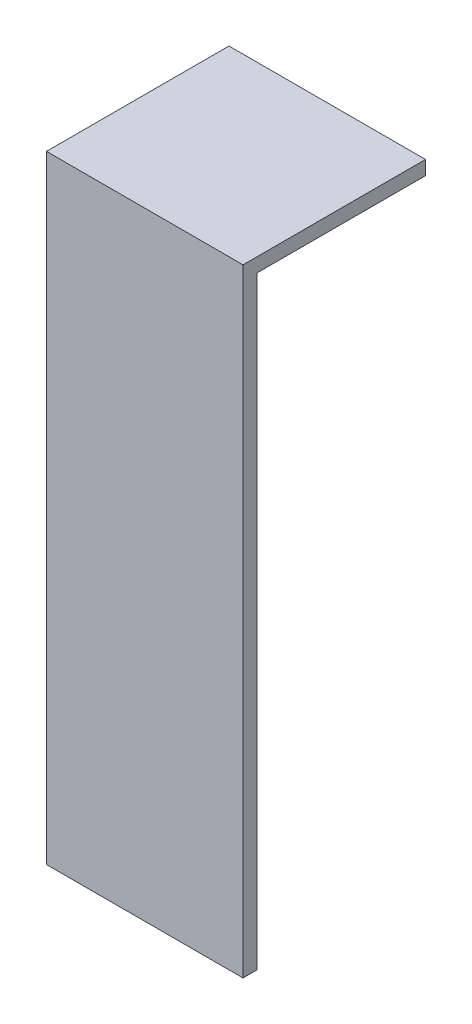
ISO-10303-21;
HEADER;
FILE_DESCRIPTION(('STEP AP214'),'2;1');
FILE_NAME('part.step','',(''),(''),'','','');
FILE_SCHEMA(('AUTOMOTIVE_DESIGN { 1 0 10303 214 1 1 1 1 }'));
ENDSEC;
DATA;
#1=APPLICATION_CONTEXT('core data for automotive mechanical design processes');
#2=APPLICATION_PROTOCOL_DEFINITION('international standard','automotive_design',2000,#1);
#3=PRODUCT_CONTEXT('',#1,'mechanical');
#4=PRODUCT('Part','Part','',(#3));
#5=PRODUCT_RELATED_PRODUCT_CATEGORY('part','',(#4));
#6=PRODUCT_DEFINITION_FORMATION('','',#4);
#7=PRODUCT_DEFINITION_CONTEXT('part definition',#1,'design');
#8=PRODUCT_DEFINITION('design','',#6,#7);
#9=PRODUCT_DEFINITION_SHAPE('','',#8);
#10=(LENGTH_UNIT() NAMED_UNIT(*) SI_UNIT(.MILLI.,.METRE.));
#11=(NAMED_UNIT(*) PLANE_ANGLE_UNIT() SI_UNIT($,.RADIAN.));
#12=(NAMED_UNIT(*) SI_UNIT($,.STERADIAN.) SOLID_ANGLE_UNIT());
#13=UNCERTAINTY_MEASURE_WITH_UNIT(LENGTH_MEASURE(1.E-05),#10,'distance_accuracy_value','');
#14=(GEOMETRIC_REPRESENTATION_CONTEXT(3) GLOBAL_UNCERTAINTY_ASSIGNED_CONTEXT((#13)) GLOBAL_UNIT_ASSIGNED_CONTEXT((#10,
#11,#12)) REPRESENTATION_CONTEXT('',''));
#15=CARTESIAN_POINT('',(0.,0.,0.));
#16=DIRECTION('',(0.,0.,1.));
#17=DIRECTION('',(1.,0.,0.));
#18=AXIS2_PLACEMENT_3D('',#15,#16,#17);
#19=CARTESIAN_POINT('',(-32.4311061643855,110.,5.));
#20=DIRECTION('',(-1.,0.,0.));
#21=DIRECTION('',(0.,-1.,0.));
#22=AXIS2_PLACEMENT_3D('',#19,#20,#21);
#23=PLANE('',#22);
#24=DIRECTION('',(0.,1.,0.));
#25=VECTOR('',#24,1.);
#26=CARTESIAN_POINT('',(-32.4311061643855,110.,0.));
#27=LINE('',#26,#25);
#28=CARTESIAN_POINT('',(-32.4311061643855,-110.,0.));
#29=VERTEX_POINT('',#28);
#30=CARTESIAN_POINT('',(-32.4311061643855,105.,0.));
#31=VERTEX_POINT('',#30);
#32=EDGE_CURVE('E127',#29,#31,#27,.T.);
#33=ORIENTED_EDGE('',*,*,#32,.T.);
#34=DIRECTION('',(0.,0.,1.));
#35=VECTOR('',#34,1.);
#36=CARTESIAN_POINT('',(-32.4311061643855,105.,-60.));
#37=LINE('',#36,#35);
#38=CARTESIAN_POINT('',(-32.4311061643855,105.,-60.));
#39=VERTEX_POINT('',#38);
#40=EDGE_CURVE('E172',#39,#31,#37,.T.);
#41=ORIENTED_EDGE('',*,*,#40,.F.);
#42=DIRECTION('',(0.,1.,0.));
#43=VECTOR('',#42,1.);
#44=CARTESIAN_POINT('',(-32.4311061643855,110.,-60.));
#45=LINE('',#44,#43);
#46=CARTESIAN_POINT('',(-32.4311061643855,110.,-60.));
#47=VERTEX_POINT('',#46);
#48=EDGE_CURVE('E219',#39,#47,#45,.T.);
#49=ORIENTED_EDGE('',*,*,#48,.T.);
#50=DIRECTION('',(0.,0.,-1.));
#51=VECTOR('',#50,1.);
#52=CARTESIAN_POINT('',(-32.4311061643855,110.,5.));
#53=LINE('',#52,#51);
#54=CARTESIAN_POINT('',(-32.4311061643855,110.,5.));
#55=VERTEX_POINT('',#54);
#56=EDGE_CURVE('E11',#55,#47,#53,.T.);
#57=ORIENTED_EDGE('',*,*,#56,.F.);
#58=DIRECTION('',(0.,1.,0.));
#59=VECTOR('',#58,1.);
#60=CARTESIAN_POINT('',(-32.4311061643855,110.,5.));
#61=LINE('',#60,#59);
#62=CARTESIAN_POINT('',(-32.4311061643855,-110.,5.));
#63=VERTEX_POINT('',#62);
#64=EDGE_CURVE('E103',#63,#55,#61,.T.);
#65=ORIENTED_EDGE('',*,*,#64,.F.);
#66=DIRECTION('',(0.,0.,-1.));
#67=VECTOR('',#66,1.);
#68=CARTESIAN_POINT('',(-32.4311061643855,-110.,5.));
#69=LINE('',#68,#67);
#70=EDGE_CURVE('E123',#63,#29,#69,.T.);
#71=ORIENTED_EDGE('',*,*,#70,.T.);
#72=EDGE_LOOP('',(#33,#41,#49,#57,#65,#71));
#73=FACE_BOUND('',#72,.T.);
#74=ADVANCED_FACE('F39',(#73),#23,.F.);
#75=CARTESIAN_POINT('',(-102.431106164386,110.,5.));
#76=DIRECTION('',(0.,-1.,0.));
#77=DIRECTION('',(0.,0.,-1.));
#78=AXIS2_PLACEMENT_3D('',#75,#76,#77);
#79=PLANE('',#78);
#80=ORIENTED_EDGE('',*,*,#56,.T.);
#81=DIRECTION('',(-1.,0.,0.));
#82=VECTOR('',#81,1.);
#83=CARTESIAN_POINT('',(-32.4311061643855,110.,-60.));
#84=LINE('',#83,#82);
#85=CARTESIAN_POINT('',(-102.431106164386,110.,-60.));
#86=VERTEX_POINT('',#85);
#87=EDGE_CURVE('E113',#47,#86,#84,.T.);
#88=ORIENTED_EDGE('',*,*,#87,.T.);
#89=DIRECTION('',(0.,0.,-1.));
#90=VECTOR('',#89,1.);
#91=CARTESIAN_POINT('',(-102.431106164386,110.,5.));
#92=LINE('',#91,#90);
#93=CARTESIAN_POINT('',(-102.431106164386,110.,5.));
#94=VERTEX_POINT('',#93);
#95=EDGE_CURVE('E47',#94,#86,#92,.T.);
#96=ORIENTED_EDGE('',*,*,#95,.F.);
#97=DIRECTION('',(-1.,0.,0.));
#98=VECTOR('',#97,1.);
#99=CARTESIAN_POINT('',(-102.431106164386,110.,5.));
#100=LINE('',#99,#98);
#101=EDGE_CURVE('E96',#55,#94,#100,.T.);
#102=ORIENTED_EDGE('',*,*,#101,.F.);
#103=EDGE_LOOP('',(#80,#88,#96,#102));
#104=FACE_BOUND('',#103,.T.);
#105=ADVANCED_FACE('F110',(#104),#79,.F.);
#106=CARTESIAN_POINT('',(-102.431106164386,110.,5.));
#107=DIRECTION('',(1.,0.,0.));
#108=DIRECTION('',(0.,1.,0.));
#109=AXIS2_PLACEMENT_3D('',#106,#107,#108);
#110=PLANE('',#109);
#111=ORIENTED_EDGE('',*,*,#95,.T.);
#112=DIRECTION('',(0.,-1.,0.));
#113=VECTOR('',#112,1.);
#114=CARTESIAN_POINT('',(-102.431106164386,110.,-60.));
#115=LINE('',#114,#113);
#116=CARTESIAN_POINT('',(-102.431106164386,105.,-60.));
#117=VERTEX_POINT('',#116);
#118=EDGE_CURVE('E214',#86,#117,#115,.T.);
#119=ORIENTED_EDGE('',*,*,#118,.T.);
#120=DIRECTION('',(0.,0.,1.));
#121=VECTOR('',#120,1.);
#122=CARTESIAN_POINT('',(-102.431106164386,105.,-60.));
#123=LINE('',#122,#121);
#124=CARTESIAN_POINT('',(-102.431106164386,105.,0.));
#125=VERTEX_POINT('',#124);
#126=EDGE_CURVE('E161',#117,#125,#123,.T.);
#127=ORIENTED_EDGE('',*,*,#126,.T.);
#128=DIRECTION('',(0.,-1.,0.));
#129=VECTOR('',#128,1.);
#130=CARTESIAN_POINT('',(-102.431106164386,110.,0.));
#131=LINE('',#130,#129);
#132=CARTESIAN_POINT('',(-102.431106164385,-9.99999999999995,0.));
#133=VERTEX_POINT('',#132);
#134=EDGE_CURVE('E54',#125,#133,#131,.T.);
#135=ORIENTED_EDGE('',*,*,#134,.T.);
#136=DIRECTION('',(0.,0.,1.));
#137=VECTOR('',#136,1.);
#138=CARTESIAN_POINT('',(-102.431106164385,-9.99999999999995,-10.));
#139=LINE('',#138,#137);
#140=CARTESIAN_POINT('',(-102.431106164385,-9.99999999999995,-10.));
#141=VERTEX_POINT('',#140);
#142=EDGE_CURVE('E82',#141,#133,#139,.T.);
#143=ORIENTED_EDGE('',*,*,#142,.F.);
#144=DIRECTION('',(0.,-1.,0.));
#145=VECTOR('',#144,1.);
#146=CARTESIAN_POINT('',(-102.431106164385,-110.,-10.));
#147=LINE('',#146,#145);
#148=CARTESIAN_POINT('',(-102.431106164385,-110.,-10.));
#149=VERTEX_POINT('',#148);
#150=EDGE_CURVE('E147',#141,#149,#147,.T.);
#151=ORIENTED_EDGE('',*,*,#150,.T.);
#152=DIRECTION('',(0.,0.,-1.));
#153=VECTOR('',#152,1.);
#154=CARTESIAN_POINT('',(-102.431106164385,-110.,5.));
#155=LINE('',#154,#153);
#156=CARTESIAN_POINT('',(-102.431106164385,-110.,5.));
#157=VERTEX_POINT('',#156);
#158=EDGE_CURVE('E117',#157,#149,#155,.T.);
#159=ORIENTED_EDGE('',*,*,#158,.F.);
#160=DIRECTION('',(0.,-1.,0.));
#161=VECTOR('',#160,1.);
#162=CARTESIAN_POINT('',(-102.431106164386,110.,5.));
#163=LINE('',#162,#161);
#164=EDGE_CURVE('E100',#94,#157,#163,.T.);
#165=ORIENTED_EDGE('',*,*,#164,.F.);
#166=EDGE_LOOP('',(#111,#119,#127,#135,#143,#151,#159,#165));
#167=FACE_BOUND('',#166,.T.);
#168=ADVANCED_FACE('F118',(#167),#110,.F.);
#169=CARTESIAN_POINT('',(-102.431106164385,-110.,5.));
#170=DIRECTION('',(0.,1.,0.));
#171=DIRECTION('',(0.,0.,1.));
#172=AXIS2_PLACEMENT_3D('',#169,#170,#171);
#173=PLANE('',#172);
#174=ORIENTED_EDGE('',*,*,#158,.T.);
#175=DIRECTION('',(1.,0.,0.));
#176=VECTOR('',#175,1.);
#177=CARTESIAN_POINT('',(-102.431106164385,-110.,-10.));
#178=LINE('',#177,#176);
#179=CARTESIAN_POINT('',(-97.4311061643855,-110.,-10.));
#180=VERTEX_POINT('',#179);
#181=EDGE_CURVE('E141',#149,#180,#178,.T.);
#182=ORIENTED_EDGE('',*,*,#181,.T.);
#183=DIRECTION('',(0.,0.,1.));
#184=VECTOR('',#183,1.);
#185=CARTESIAN_POINT('',(-97.4311061643855,-110.,-10.));
#186=LINE('',#185,#184);
#187=CARTESIAN_POINT('',(-97.4311061643855,-110.,0.));
#188=VERTEX_POINT('',#187);
#189=EDGE_CURVE('E169',#180,#188,#186,.T.);
#190=ORIENTED_EDGE('',*,*,#189,.T.);
#191=DIRECTION('',(1.,0.,0.));
#192=VECTOR('',#191,1.);
#193=CARTESIAN_POINT('',(-102.431106164385,-110.,0.));
#194=LINE('',#193,#192);
#195=EDGE_CURVE('E75',#188,#29,#194,.T.);
#196=ORIENTED_EDGE('',*,*,#195,.T.);
#197=ORIENTED_EDGE('',*,*,#70,.F.);
#198=DIRECTION('',(1.,0.,0.));
#199=VECTOR('',#198,1.);
#200=CARTESIAN_POINT('',(-102.431106164385,-110.,5.));
#201=LINE('',#200,#199);
#202=EDGE_CURVE('E63',#157,#63,#201,.T.);
#203=ORIENTED_EDGE('',*,*,#202,.F.);
#204=EDGE_LOOP('',(#174,#182,#190,#196,#197,#203));
#205=FACE_BOUND('',#204,.T.);
#206=ADVANCED_FACE('F140',(#205),#173,.F.);
#207=CARTESIAN_POINT('',(0.,0.,5.));
#208=DIRECTION('',(0.,0.,1.));
#209=DIRECTION('',(1.,0.,0.));
#210=AXIS2_PLACEMENT_3D('',#207,#208,#209);
#211=PLANE('',#210);
#212=ORIENTED_EDGE('',*,*,#64,.T.);
#213=ORIENTED_EDGE('',*,*,#101,.T.);
#214=ORIENTED_EDGE('',*,*,#164,.T.);
#215=ORIENTED_EDGE('',*,*,#202,.T.);
#216=EDGE_LOOP('',(#212,#213,#214,#215));
#217=FACE_BOUND('',#216,.T.);
#218=ADVANCED_FACE('F98',(#217),#211,.T.);
#219=CARTESIAN_POINT('',(0.,0.,0.));
#220=DIRECTION('',(0.,0.,1.));
#221=DIRECTION('',(1.,0.,0.));
#222=AXIS2_PLACEMENT_3D('',#219,#220,#221);
#223=PLANE('',#222);
#224=ORIENTED_EDGE('',*,*,#134,.F.);
#225=DIRECTION('',(1.,0.,0.));
#226=VECTOR('',#225,1.);
#227=CARTESIAN_POINT('',(-32.4311061643855,105.,0.));
#228=LINE('',#227,#226);
#229=EDGE_CURVE('E192',#125,#31,#228,.T.);
#230=ORIENTED_EDGE('',*,*,#229,.T.);
#231=ORIENTED_EDGE('',*,*,#32,.F.);
#232=ORIENTED_EDGE('',*,*,#195,.F.);
#233=DIRECTION('',(0.,1.,0.));
#234=VECTOR('',#233,1.);
#235=CARTESIAN_POINT('',(-97.4311061643855,-110.,0.));
#236=LINE('',#235,#234);
#237=CARTESIAN_POINT('',(-97.4311061643855,-9.99999999999995,0.));
#238=VERTEX_POINT('',#237);
#239=EDGE_CURVE('E158',#188,#238,#236,.T.);
#240=ORIENTED_EDGE('',*,*,#239,.T.);
#241=DIRECTION('',(-1.,0.,0.));
#242=VECTOR('',#241,1.);
#243=CARTESIAN_POINT('',(-102.431106164385,-9.99999999999995,0.));
#244=LINE('',#243,#242);
#245=EDGE_CURVE('E154',#238,#133,#244,.T.);
#246=ORIENTED_EDGE('',*,*,#245,.T.);
#247=EDGE_LOOP('',(#224,#230,#231,#232,#240,#246));
#248=FACE_BOUND('',#247,.T.);
#249=ADVANCED_FACE('F188',(#248),#223,.F.);
#250=CARTESIAN_POINT('',(-102.431106164385,-9.99999999999995,-10.));
#251=DIRECTION('',(0.,1.,0.));
#252=DIRECTION('',(0.,0.,1.));
#253=AXIS2_PLACEMENT_3D('',#250,#251,#252);
#254=PLANE('',#253);
#255=ORIENTED_EDGE('',*,*,#245,.F.);
#256=DIRECTION('',(0.,0.,1.));
#257=VECTOR('',#256,1.);
#258=CARTESIAN_POINT('',(-97.4311061643855,-9.99999999999995,-10.));
#259=LINE('',#258,#257);
#260=CARTESIAN_POINT('',(-97.4311061643855,-9.99999999999995,-10.));
#261=VERTEX_POINT('',#260);
#262=EDGE_CURVE('E176',#261,#238,#259,.T.);
#263=ORIENTED_EDGE('',*,*,#262,.F.);
#264=DIRECTION('',(-1.,0.,0.));
#265=VECTOR('',#264,1.);
#266=CARTESIAN_POINT('',(-102.431106164385,-9.99999999999995,-10.));
#267=LINE('',#266,#265);
#268=EDGE_CURVE('E166',#261,#141,#267,.T.);
#269=ORIENTED_EDGE('',*,*,#268,.T.);
#270=ORIENTED_EDGE('',*,*,#142,.T.);
#271=EDGE_LOOP('',(#255,#263,#269,#270));
#272=FACE_BOUND('',#271,.T.);
#273=ADVANCED_FACE('F248',(#272),#254,.T.);
#274=CARTESIAN_POINT('',(-97.4311061643855,-110.,-10.));
#275=DIRECTION('',(1.,0.,0.));
#276=DIRECTION('',(0.,0.,-1.));
#277=AXIS2_PLACEMENT_3D('',#274,#275,#276);
#278=PLANE('',#277);
#279=ORIENTED_EDGE('',*,*,#239,.F.);
#280=ORIENTED_EDGE('',*,*,#189,.F.);
#281=DIRECTION('',(0.,1.,0.));
#282=VECTOR('',#281,1.);
#283=CARTESIAN_POINT('',(-97.4311061643855,-110.,-10.));
#284=LINE('',#283,#282);
#285=EDGE_CURVE('E150',#180,#261,#284,.T.);
#286=ORIENTED_EDGE('',*,*,#285,.T.);
#287=ORIENTED_EDGE('',*,*,#262,.T.);
#288=EDGE_LOOP('',(#279,#280,#286,#287));
#289=FACE_BOUND('',#288,.T.);
#290=ADVANCED_FACE('F184',(#289),#278,.T.);
#291=CARTESIAN_POINT('',(0.,0.,-10.));
#292=DIRECTION('',(0.,0.,-1.));
#293=DIRECTION('',(-1.,0.,0.));
#294=AXIS2_PLACEMENT_3D('',#291,#292,#293);
#295=PLANE('',#294);
#296=ORIENTED_EDGE('',*,*,#150,.F.);
#297=ORIENTED_EDGE('',*,*,#268,.F.);
#298=ORIENTED_EDGE('',*,*,#285,.F.);
#299=ORIENTED_EDGE('',*,*,#181,.F.);
#300=EDGE_LOOP('',(#296,#297,#298,#299));
#301=FACE_BOUND('',#300,.T.);
#302=ADVANCED_FACE('F145',(#301),#295,.T.);
#303=CARTESIAN_POINT('',(-32.4311061643855,105.,-60.));
#304=DIRECTION('',(0.,-1.,0.));
#305=DIRECTION('',(1.,0.,0.));
#306=AXIS2_PLACEMENT_3D('',#303,#304,#305);
#307=PLANE('',#306);
#308=ORIENTED_EDGE('',*,*,#229,.F.);
#309=ORIENTED_EDGE('',*,*,#126,.F.);
#310=DIRECTION('',(1.,0.,0.));
#311=VECTOR('',#310,1.);
#312=CARTESIAN_POINT('',(-32.4311061643855,105.,-60.));
#313=LINE('',#312,#311);
#314=EDGE_CURVE('E212',#117,#39,#313,.T.);
#315=ORIENTED_EDGE('',*,*,#314,.T.);
#316=ORIENTED_EDGE('',*,*,#40,.T.);
#317=EDGE_LOOP('',(#308,#309,#315,#316));
#318=FACE_BOUND('',#317,.T.);
#319=ADVANCED_FACE('F210',(#318),#307,.T.);
#320=CARTESIAN_POINT('',(0.,0.,-60.));
#321=DIRECTION('',(0.,0.,-1.));
#322=DIRECTION('',(-1.,0.,0.));
#323=AXIS2_PLACEMENT_3D('',#320,#321,#322);
#324=PLANE('',#323);
#325=ORIENTED_EDGE('',*,*,#48,.F.);
#326=ORIENTED_EDGE('',*,*,#314,.F.);
#327=ORIENTED_EDGE('',*,*,#118,.F.);
#328=ORIENTED_EDGE('',*,*,#87,.F.);
#329=EDGE_LOOP('',(#325,#326,#327,#328));
#330=FACE_BOUND('',#329,.T.);
#331=ADVANCED_FACE('F218',(#330),#324,.T.);
#332=CLOSED_SHELL('',(#74,#105,#168,#206,#218,#249,#273,#290,#302,#319,#331));
#333=MANIFOLD_SOLID_BREP('B2',#332);
#334=ADVANCED_BREP_SHAPE_REPRESENTATION('',(#18,#333),#14);
#335=SHAPE_DEFINITION_REPRESENTATION(#9,#334);
ENDSEC;
END-ISO-10303-21;
